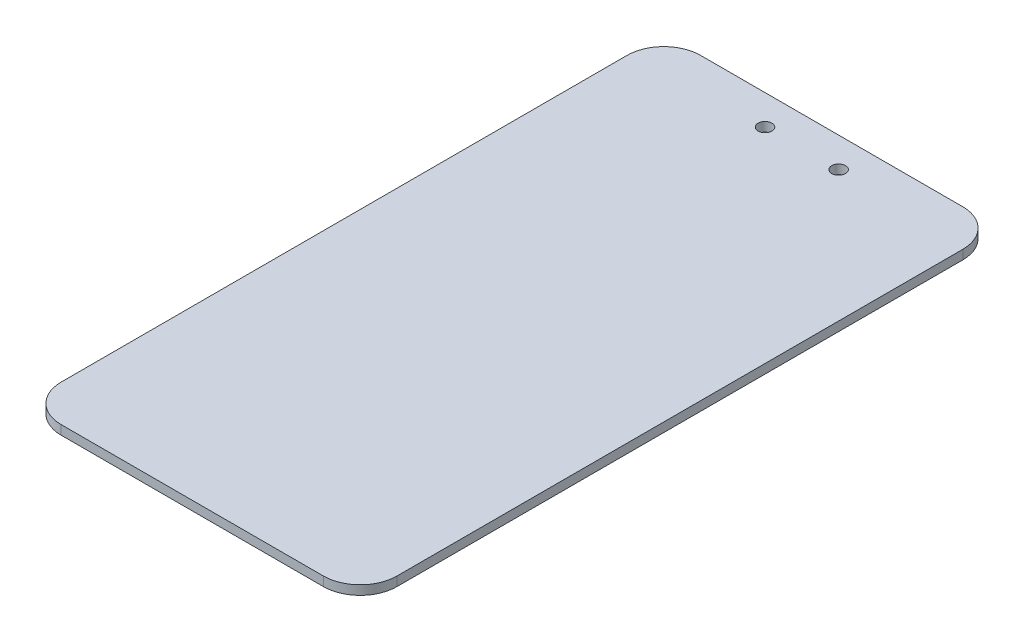
ISO-10303-21;
HEADER;
FILE_DESCRIPTION(('STEP AP214'),'2;1');
FILE_NAME('part.step','',(''),(''),'','','');
FILE_SCHEMA(('AUTOMOTIVE_DESIGN { 1 0 10303 214 1 1 1 1 }'));
ENDSEC;
DATA;
#1=APPLICATION_CONTEXT('core data for automotive mechanical design processes');
#2=APPLICATION_PROTOCOL_DEFINITION('international standard','automotive_design',2000,#1);
#3=PRODUCT_CONTEXT('',#1,'mechanical');
#4=PRODUCT('Part','Part','',(#3));
#5=PRODUCT_RELATED_PRODUCT_CATEGORY('part','',(#4));
#6=PRODUCT_DEFINITION_FORMATION('','',#4);
#7=PRODUCT_DEFINITION_CONTEXT('part definition',#1,'design');
#8=PRODUCT_DEFINITION('design','',#6,#7);
#9=PRODUCT_DEFINITION_SHAPE('','',#8);
#10=(LENGTH_UNIT() NAMED_UNIT(*) SI_UNIT(.MILLI.,.METRE.));
#11=(NAMED_UNIT(*) PLANE_ANGLE_UNIT() SI_UNIT($,.RADIAN.));
#12=(NAMED_UNIT(*) SI_UNIT($,.STERADIAN.) SOLID_ANGLE_UNIT());
#13=UNCERTAINTY_MEASURE_WITH_UNIT(LENGTH_MEASURE(1.E-05),#10,'distance_accuracy_value','');
#14=(GEOMETRIC_REPRESENTATION_CONTEXT(3) GLOBAL_UNCERTAINTY_ASSIGNED_CONTEXT((#13)) GLOBAL_UNIT_ASSIGNED_CONTEXT((#10,
#11,#12)) REPRESENTATION_CONTEXT('',''));
#15=CARTESIAN_POINT('',(0.,0.,0.));
#16=DIRECTION('',(0.,0.,1.));
#17=DIRECTION('',(1.,0.,0.));
#18=AXIS2_PLACEMENT_3D('',#15,#16,#17);
#19=CARTESIAN_POINT('',(8.,2.,-8.));
#20=DIRECTION('',(0.,-1.,0.));
#21=DIRECTION('',(0.,0.,-1.));
#22=AXIS2_PLACEMENT_3D('',#19,#20,#21);
#23=PLANE('',#22);
#24=CARTESIAN_POINT('',(8.,2.,-8.));
#25=DIRECTION('',(0.,1.,0.));
#26=DIRECTION('',(0.,0.,-1.));
#27=AXIS2_PLACEMENT_3D('',#24,#25,#26);
#28=CIRCLE('',#27,8.);
#29=CARTESIAN_POINT('',(0.,2.,-8.00000000000006));
#30=VERTEX_POINT('',#29);
#31=CARTESIAN_POINT('',(8.00000000000006,2.,0.));
#32=VERTEX_POINT('',#31);
#33=EDGE_CURVE('E170',#30,#32,#28,.T.);
#34=ORIENTED_EDGE('',*,*,#33,.T.);
#35=DIRECTION('',(1.,0.,0.));
#36=VECTOR('',#35,1.);
#37=CARTESIAN_POINT('',(8.00000000000006,2.,0.));
#38=LINE('',#37,#36);
#39=CARTESIAN_POINT('',(64.9999999999999,2.,0.));
#40=VERTEX_POINT('',#39);
#41=EDGE_CURVE('E106',#32,#40,#38,.T.);
#42=ORIENTED_EDGE('',*,*,#41,.T.);
#43=CARTESIAN_POINT('',(65.,2.,-8.));
#44=DIRECTION('',(0.,1.,0.));
#45=DIRECTION('',(0.,0.,1.));
#46=AXIS2_PLACEMENT_3D('',#43,#44,#45);
#47=CIRCLE('',#46,8.);
#48=CARTESIAN_POINT('',(73.,2.,-8.00000000000005));
#49=VERTEX_POINT('',#48);
#50=EDGE_CURVE('E191',#40,#49,#47,.T.);
#51=ORIENTED_EDGE('',*,*,#50,.T.);
#52=DIRECTION('',(0.,0.,-1.));
#53=VECTOR('',#52,1.);
#54=CARTESIAN_POINT('',(73.,2.,-8.00000000000006));
#55=LINE('',#54,#53);
#56=CARTESIAN_POINT('',(73.,2.,-131.));
#57=VERTEX_POINT('',#56);
#58=EDGE_CURVE('E205',#49,#57,#55,.T.);
#59=ORIENTED_EDGE('',*,*,#58,.T.);
#60=CARTESIAN_POINT('',(65.,2.,-131.));
#61=DIRECTION('',(0.,1.,0.));
#62=DIRECTION('',(0.,0.,-1.));
#63=AXIS2_PLACEMENT_3D('',#60,#61,#62);
#64=CIRCLE('',#63,8.);
#65=CARTESIAN_POINT('',(64.9999999999999,2.,-139.));
#66=VERTEX_POINT('',#65);
#67=EDGE_CURVE('E125',#57,#66,#64,.T.);
#68=ORIENTED_EDGE('',*,*,#67,.T.);
#69=DIRECTION('',(-1.,0.,0.));
#70=VECTOR('',#69,1.);
#71=CARTESIAN_POINT('',(8.00000000000006,2.,-139.));
#72=LINE('',#71,#70);
#73=CARTESIAN_POINT('',(8.00000000000006,2.,-139.));
#74=VERTEX_POINT('',#73);
#75=EDGE_CURVE('E119',#66,#74,#72,.T.);
#76=ORIENTED_EDGE('',*,*,#75,.T.);
#77=CARTESIAN_POINT('',(8.,2.,-131.));
#78=DIRECTION('',(0.,1.,0.));
#79=DIRECTION('',(0.,0.,-1.));
#80=AXIS2_PLACEMENT_3D('',#77,#78,#79);
#81=CIRCLE('',#80,8.);
#82=CARTESIAN_POINT('',(0.,2.,-131.));
#83=VERTEX_POINT('',#82);
#84=EDGE_CURVE('E123',#74,#83,#81,.T.);
#85=ORIENTED_EDGE('',*,*,#84,.T.);
#86=DIRECTION('',(0.,0.,1.));
#87=VECTOR('',#86,1.);
#88=CARTESIAN_POINT('',(0.,2.,-8.00000000000006));
#89=LINE('',#88,#87);
#90=EDGE_CURVE('E63',#83,#30,#89,.T.);
#91=ORIENTED_EDGE('',*,*,#90,.T.);
#92=EDGE_LOOP('',(#34,#42,#51,#59,#68,#76,#85,#91));
#93=FACE_BOUND('',#92,.T.);
#94=CARTESIAN_POINT('',(44.5,2.,-132.5));
#95=DIRECTION('',(0.,1.,0.));
#96=DIRECTION('',(0.,0.,1.));
#97=AXIS2_PLACEMENT_3D('',#94,#95,#96);
#98=CIRCLE('',#97,1.5);
#99=CARTESIAN_POINT('',(44.5,2.,-131.));
#100=VERTEX_POINT('',#99);
#101=EDGE_CURVE('E152',#100,#100,#98,.T.);
#102=ORIENTED_EDGE('',*,*,#101,.F.);
#103=EDGE_LOOP('',(#102));
#104=FACE_BOUND('',#103,.T.);
#105=CARTESIAN_POINT('',(28.5,2.,-132.5));
#106=DIRECTION('',(0.,1.,0.));
#107=DIRECTION('',(0.,0.,-1.));
#108=AXIS2_PLACEMENT_3D('',#105,#106,#107);
#109=CIRCLE('',#108,1.5);
#110=CARTESIAN_POINT('',(28.5,2.,-134.));
#111=VERTEX_POINT('',#110);
#112=EDGE_CURVE('E219',#111,#111,#109,.T.);
#113=ORIENTED_EDGE('',*,*,#112,.F.);
#114=EDGE_LOOP('',(#113));
#115=FACE_BOUND('',#114,.T.);
#116=ADVANCED_FACE('F45',(#93,#104,#115),#23,.F.);
#117=CARTESIAN_POINT('',(8.,0.,-8.));
#118=DIRECTION('',(0.,-1.,0.));
#119=DIRECTION('',(0.,0.,-1.));
#120=AXIS2_PLACEMENT_3D('',#117,#118,#119);
#121=PLANE('',#120);
#122=CARTESIAN_POINT('',(44.5,0.,-132.5));
#123=DIRECTION('',(0.,1.,0.));
#124=DIRECTION('',(0.,0.,1.));
#125=AXIS2_PLACEMENT_3D('',#122,#123,#124);
#126=CIRCLE('',#125,1.5);
#127=CARTESIAN_POINT('',(44.5,0.,-131.));
#128=VERTEX_POINT('',#127);
#129=EDGE_CURVE('E215',#128,#128,#126,.T.);
#130=ORIENTED_EDGE('',*,*,#129,.T.);
#131=EDGE_LOOP('',(#130));
#132=FACE_BOUND('',#131,.T.);
#133=CARTESIAN_POINT('',(8.,0.,-8.));
#134=DIRECTION('',(0.,1.,0.));
#135=DIRECTION('',(0.,0.,-1.));
#136=AXIS2_PLACEMENT_3D('',#133,#134,#135);
#137=CIRCLE('',#136,8.);
#138=CARTESIAN_POINT('',(0.,0.,-8.00000000000006));
#139=VERTEX_POINT('',#138);
#140=CARTESIAN_POINT('',(8.00000000000006,0.,0.));
#141=VERTEX_POINT('',#140);
#142=EDGE_CURVE('E147',#139,#141,#137,.T.);
#143=ORIENTED_EDGE('',*,*,#142,.F.);
#144=DIRECTION('',(0.,0.,1.));
#145=VECTOR('',#144,1.);
#146=CARTESIAN_POINT('',(0.,0.,-8.00000000000006));
#147=LINE('',#146,#145);
#148=CARTESIAN_POINT('',(0.,0.,-131.));
#149=VERTEX_POINT('',#148);
#150=EDGE_CURVE('E98',#149,#139,#147,.T.);
#151=ORIENTED_EDGE('',*,*,#150,.F.);
#152=CARTESIAN_POINT('',(8.,0.,-131.));
#153=DIRECTION('',(0.,1.,0.));
#154=DIRECTION('',(0.,0.,-1.));
#155=AXIS2_PLACEMENT_3D('',#152,#153,#154);
#156=CIRCLE('',#155,8.);
#157=CARTESIAN_POINT('',(8.00000000000006,0.,-139.));
#158=VERTEX_POINT('',#157);
#159=EDGE_CURVE('E92',#158,#149,#156,.T.);
#160=ORIENTED_EDGE('',*,*,#159,.F.);
#161=DIRECTION('',(-1.,0.,0.));
#162=VECTOR('',#161,1.);
#163=CARTESIAN_POINT('',(8.00000000000006,0.,-139.));
#164=LINE('',#163,#162);
#165=CARTESIAN_POINT('',(64.9999999999999,0.,-139.));
#166=VERTEX_POINT('',#165);
#167=EDGE_CURVE('E134',#166,#158,#164,.T.);
#168=ORIENTED_EDGE('',*,*,#167,.F.);
#169=CARTESIAN_POINT('',(65.,0.,-131.));
#170=DIRECTION('',(0.,1.,0.));
#171=DIRECTION('',(0.,0.,-1.));
#172=AXIS2_PLACEMENT_3D('',#169,#170,#171);
#173=CIRCLE('',#172,8.);
#174=CARTESIAN_POINT('',(73.,0.,-131.));
#175=VERTEX_POINT('',#174);
#176=EDGE_CURVE('E161',#175,#166,#173,.T.);
#177=ORIENTED_EDGE('',*,*,#176,.F.);
#178=DIRECTION('',(0.,0.,-1.));
#179=VECTOR('',#178,1.);
#180=CARTESIAN_POINT('',(73.,0.,-8.00000000000006));
#181=LINE('',#180,#179);
#182=CARTESIAN_POINT('',(73.,0.,-8.00000000000005));
#183=VERTEX_POINT('',#182);
#184=EDGE_CURVE('E158',#183,#175,#181,.T.);
#185=ORIENTED_EDGE('',*,*,#184,.F.);
#186=CARTESIAN_POINT('',(65.,0.,-8.));
#187=DIRECTION('',(0.,1.,0.));
#188=DIRECTION('',(0.,0.,1.));
#189=AXIS2_PLACEMENT_3D('',#186,#187,#188);
#190=CIRCLE('',#189,8.);
#191=CARTESIAN_POINT('',(64.9999999999999,0.,0.));
#192=VERTEX_POINT('',#191);
#193=EDGE_CURVE('E155',#192,#183,#190,.T.);
#194=ORIENTED_EDGE('',*,*,#193,.F.);
#195=DIRECTION('',(1.,0.,0.));
#196=VECTOR('',#195,1.);
#197=CARTESIAN_POINT('',(8.00000000000006,0.,0.));
#198=LINE('',#197,#196);
#199=EDGE_CURVE('E151',#141,#192,#198,.T.);
#200=ORIENTED_EDGE('',*,*,#199,.F.);
#201=EDGE_LOOP('',(#143,#151,#160,#168,#177,#185,#194,#200));
#202=FACE_BOUND('',#201,.T.);
#203=CARTESIAN_POINT('',(28.5,0.,-132.5));
#204=DIRECTION('',(0.,1.,0.));
#205=DIRECTION('',(0.,0.,-1.));
#206=AXIS2_PLACEMENT_3D('',#203,#204,#205);
#207=CIRCLE('',#206,1.5);
#208=CARTESIAN_POINT('',(28.5,0.,-134.));
#209=VERTEX_POINT('',#208);
#210=EDGE_CURVE('E223',#209,#209,#207,.T.);
#211=ORIENTED_EDGE('',*,*,#210,.T.);
#212=EDGE_LOOP('',(#211));
#213=FACE_BOUND('',#212,.T.);
#214=ADVANCED_FACE('F195',(#132,#202,#213),#121,.T.);
#215=CARTESIAN_POINT('',(8.,2.,-8.));
#216=DIRECTION('',(0.,-1.,0.));
#217=DIRECTION('',(0.,0.,-1.));
#218=AXIS2_PLACEMENT_3D('',#215,#216,#217);
#219=CYLINDRICAL_SURFACE('',#218,8.);
#220=ORIENTED_EDGE('',*,*,#142,.T.);
#221=DIRECTION('',(0.,-1.,0.));
#222=VECTOR('',#221,1.);
#223=CARTESIAN_POINT('',(8.00000000000006,2.,0.));
#224=LINE('',#223,#222);
#225=EDGE_CURVE('E11',#32,#141,#224,.T.);
#226=ORIENTED_EDGE('',*,*,#225,.F.);
#227=ORIENTED_EDGE('',*,*,#33,.F.);
#228=DIRECTION('',(0.,-1.,0.));
#229=VECTOR('',#228,1.);
#230=CARTESIAN_POINT('',(0.,2.,-8.00000000000006));
#231=LINE('',#230,#229);
#232=EDGE_CURVE('E143',#30,#139,#231,.T.);
#233=ORIENTED_EDGE('',*,*,#232,.T.);
#234=EDGE_LOOP('',(#220,#226,#227,#233));
#235=FACE_BOUND('',#234,.T.);
#236=ADVANCED_FACE('F47',(#235),#219,.T.);
#237=CARTESIAN_POINT('',(8.00000000000006,2.,0.));
#238=DIRECTION('',(0.,0.,-1.));
#239=DIRECTION('',(-1.,0.,0.));
#240=AXIS2_PLACEMENT_3D('',#237,#238,#239);
#241=PLANE('',#240);
#242=ORIENTED_EDGE('',*,*,#199,.T.);
#243=DIRECTION('',(0.,-1.,0.));
#244=VECTOR('',#243,1.);
#245=CARTESIAN_POINT('',(64.9999999999999,2.,0.));
#246=LINE('',#245,#244);
#247=EDGE_CURVE('E55',#40,#192,#246,.T.);
#248=ORIENTED_EDGE('',*,*,#247,.F.);
#249=ORIENTED_EDGE('',*,*,#41,.F.);
#250=ORIENTED_EDGE('',*,*,#225,.T.);
#251=EDGE_LOOP('',(#242,#248,#249,#250));
#252=FACE_BOUND('',#251,.T.);
#253=ADVANCED_FACE('F257',(#252),#241,.F.);
#254=CARTESIAN_POINT('',(65.,2.,-8.));
#255=DIRECTION('',(0.,-1.,0.));
#256=DIRECTION('',(0.,0.,-1.));
#257=AXIS2_PLACEMENT_3D('',#254,#255,#256);
#258=CYLINDRICAL_SURFACE('',#257,8.);
#259=ORIENTED_EDGE('',*,*,#193,.T.);
#260=DIRECTION('',(0.,-1.,0.));
#261=VECTOR('',#260,1.);
#262=CARTESIAN_POINT('',(73.,2.,-8.00000000000005));
#263=LINE('',#262,#261);
#264=EDGE_CURVE('E181',#49,#183,#263,.T.);
#265=ORIENTED_EDGE('',*,*,#264,.F.);
#266=ORIENTED_EDGE('',*,*,#50,.F.);
#267=ORIENTED_EDGE('',*,*,#247,.T.);
#268=EDGE_LOOP('',(#259,#265,#266,#267));
#269=FACE_BOUND('',#268,.T.);
#270=ADVANCED_FACE('F189',(#269),#258,.T.);
#271=CARTESIAN_POINT('',(73.,2.,-8.00000000000006));
#272=DIRECTION('',(-1.,0.,0.));
#273=DIRECTION('',(0.,0.,1.));
#274=AXIS2_PLACEMENT_3D('',#271,#272,#273);
#275=PLANE('',#274);
#276=ORIENTED_EDGE('',*,*,#184,.T.);
#277=DIRECTION('',(0.,-1.,0.));
#278=VECTOR('',#277,1.);
#279=CARTESIAN_POINT('',(73.,2.,-131.));
#280=LINE('',#279,#278);
#281=EDGE_CURVE('E177',#57,#175,#280,.T.);
#282=ORIENTED_EDGE('',*,*,#281,.F.);
#283=ORIENTED_EDGE('',*,*,#58,.F.);
#284=ORIENTED_EDGE('',*,*,#264,.T.);
#285=EDGE_LOOP('',(#276,#282,#283,#284));
#286=FACE_BOUND('',#285,.T.);
#287=ADVANCED_FACE('F200',(#286),#275,.F.);
#288=CARTESIAN_POINT('',(65.,2.,-131.));
#289=DIRECTION('',(0.,-1.,0.));
#290=DIRECTION('',(0.,0.,-1.));
#291=AXIS2_PLACEMENT_3D('',#288,#289,#290);
#292=CYLINDRICAL_SURFACE('',#291,8.);
#293=ORIENTED_EDGE('',*,*,#176,.T.);
#294=DIRECTION('',(0.,-1.,0.));
#295=VECTOR('',#294,1.);
#296=CARTESIAN_POINT('',(64.9999999999999,2.,-139.));
#297=LINE('',#296,#295);
#298=EDGE_CURVE('E136',#66,#166,#297,.T.);
#299=ORIENTED_EDGE('',*,*,#298,.F.);
#300=ORIENTED_EDGE('',*,*,#67,.F.);
#301=ORIENTED_EDGE('',*,*,#281,.T.);
#302=EDGE_LOOP('',(#293,#299,#300,#301));
#303=FACE_BOUND('',#302,.T.);
#304=ADVANCED_FACE('F203',(#303),#292,.T.);
#305=CARTESIAN_POINT('',(8.00000000000006,2.,-139.));
#306=DIRECTION('',(0.,0.,1.));
#307=DIRECTION('',(1.,0.,0.));
#308=AXIS2_PLACEMENT_3D('',#305,#306,#307);
#309=PLANE('',#308);
#310=ORIENTED_EDGE('',*,*,#167,.T.);
#311=DIRECTION('',(0.,-1.,0.));
#312=VECTOR('',#311,1.);
#313=CARTESIAN_POINT('',(8.00000000000006,2.,-139.));
#314=LINE('',#313,#312);
#315=EDGE_CURVE('E131',#74,#158,#314,.T.);
#316=ORIENTED_EDGE('',*,*,#315,.F.);
#317=ORIENTED_EDGE('',*,*,#75,.F.);
#318=ORIENTED_EDGE('',*,*,#298,.T.);
#319=EDGE_LOOP('',(#310,#316,#317,#318));
#320=FACE_BOUND('',#319,.T.);
#321=ADVANCED_FACE('F132',(#320),#309,.F.);
#322=CARTESIAN_POINT('',(8.,2.,-131.));
#323=DIRECTION('',(0.,-1.,0.));
#324=DIRECTION('',(0.,0.,-1.));
#325=AXIS2_PLACEMENT_3D('',#322,#323,#324);
#326=CYLINDRICAL_SURFACE('',#325,8.);
#327=ORIENTED_EDGE('',*,*,#159,.T.);
#328=DIRECTION('',(0.,-1.,0.));
#329=VECTOR('',#328,1.);
#330=CARTESIAN_POINT('',(0.,2.,-131.));
#331=LINE('',#330,#329);
#332=EDGE_CURVE('E137',#83,#149,#331,.T.);
#333=ORIENTED_EDGE('',*,*,#332,.F.);
#334=ORIENTED_EDGE('',*,*,#84,.F.);
#335=ORIENTED_EDGE('',*,*,#315,.T.);
#336=EDGE_LOOP('',(#327,#333,#334,#335));
#337=FACE_BOUND('',#336,.T.);
#338=ADVANCED_FACE('F139',(#337),#326,.T.);
#339=CARTESIAN_POINT('',(0.,2.,-8.00000000000006));
#340=DIRECTION('',(1.,0.,0.));
#341=DIRECTION('',(0.,0.,-1.));
#342=AXIS2_PLACEMENT_3D('',#339,#340,#341);
#343=PLANE('',#342);
#344=ORIENTED_EDGE('',*,*,#150,.T.);
#345=ORIENTED_EDGE('',*,*,#232,.F.);
#346=ORIENTED_EDGE('',*,*,#90,.F.);
#347=ORIENTED_EDGE('',*,*,#332,.T.);
#348=EDGE_LOOP('',(#344,#345,#346,#347));
#349=FACE_BOUND('',#348,.T.);
#350=ADVANCED_FACE('F245',(#349),#343,.F.);
#351=CARTESIAN_POINT('',(44.5,2.,-132.5));
#352=DIRECTION('',(0.,-1.,0.));
#353=DIRECTION('',(0.,0.,-1.));
#354=AXIS2_PLACEMENT_3D('',#351,#352,#353);
#355=CYLINDRICAL_SURFACE('',#354,1.5);
#356=ORIENTED_EDGE('',*,*,#101,.T.);
#357=EDGE_LOOP('',(#356));
#358=FACE_BOUND('',#357,.T.);
#359=ORIENTED_EDGE('',*,*,#129,.F.);
#360=EDGE_LOOP('',(#359));
#361=FACE_BOUND('',#360,.T.);
#362=ADVANCED_FACE('F242',(#358,#361),#355,.F.);
#363=CARTESIAN_POINT('',(28.5,2.,-132.5));
#364=DIRECTION('',(0.,-1.,0.));
#365=DIRECTION('',(0.,0.,-1.));
#366=AXIS2_PLACEMENT_3D('',#363,#364,#365);
#367=CYLINDRICAL_SURFACE('',#366,1.5);
#368=ORIENTED_EDGE('',*,*,#112,.T.);
#369=EDGE_LOOP('',(#368));
#370=FACE_BOUND('',#369,.T.);
#371=ORIENTED_EDGE('',*,*,#210,.F.);
#372=EDGE_LOOP('',(#371));
#373=FACE_BOUND('',#372,.T.);
#374=ADVANCED_FACE('F231',(#370,#373),#367,.F.);
#375=CLOSED_SHELL('',(#116,#214,#236,#253,#270,#287,#304,#321,#338,#350,#362,#374));
#376=MANIFOLD_SOLID_BREP('B2',#375);
#377=ADVANCED_BREP_SHAPE_REPRESENTATION('',(#18,#376),#14);
#378=SHAPE_DEFINITION_REPRESENTATION(#9,#377);
ENDSEC;
END-ISO-10303-21;
